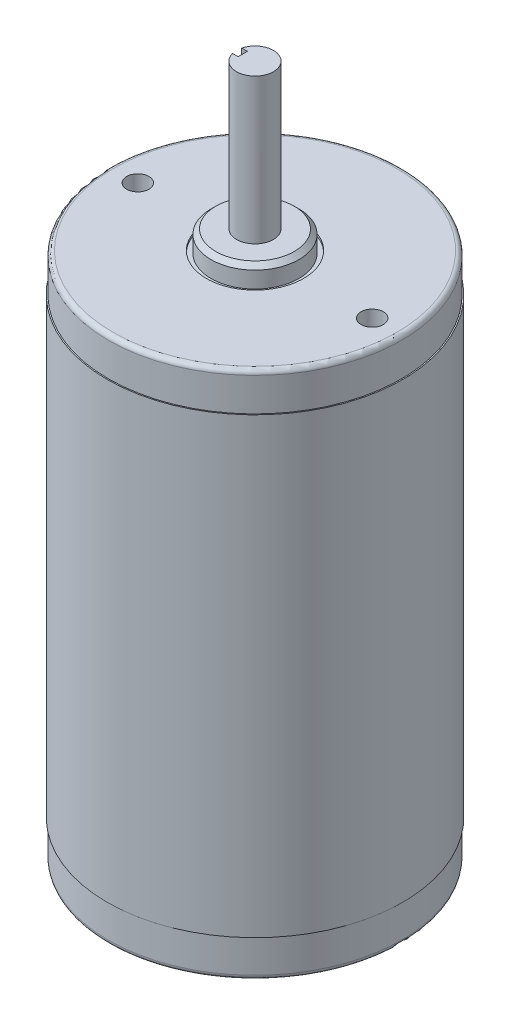
ISO-10303-21;
HEADER;
FILE_DESCRIPTION(('STEP AP214'),'2;1');
FILE_NAME('part.step','',(''),(''),'','','');
FILE_SCHEMA(('AUTOMOTIVE_DESIGN { 1 0 10303 214 1 1 1 1 }'));
ENDSEC;
DATA;
#1=APPLICATION_CONTEXT('core data for automotive mechanical design processes');
#2=APPLICATION_PROTOCOL_DEFINITION('international standard','automotive_design',2000,#1);
#3=PRODUCT_CONTEXT('',#1,'mechanical');
#4=PRODUCT('Part','Part','',(#3));
#5=PRODUCT_RELATED_PRODUCT_CATEGORY('part','',(#4));
#6=PRODUCT_DEFINITION_FORMATION('','',#4);
#7=PRODUCT_DEFINITION_CONTEXT('part definition',#1,'design');
#8=PRODUCT_DEFINITION('design','',#6,#7);
#9=PRODUCT_DEFINITION_SHAPE('','',#8);
#10=(LENGTH_UNIT() NAMED_UNIT(*) SI_UNIT(.MILLI.,.METRE.));
#11=(NAMED_UNIT(*) PLANE_ANGLE_UNIT() SI_UNIT($,.RADIAN.));
#12=(NAMED_UNIT(*) SI_UNIT($,.STERADIAN.) SOLID_ANGLE_UNIT());
#13=UNCERTAINTY_MEASURE_WITH_UNIT(LENGTH_MEASURE(1.E-05),#10,'distance_accuracy_value','');
#14=(GEOMETRIC_REPRESENTATION_CONTEXT(3) GLOBAL_UNCERTAINTY_ASSIGNED_CONTEXT((#13)) GLOBAL_UNIT_ASSIGNED_CONTEXT((#10,
#11,#12)) REPRESENTATION_CONTEXT('',''));
#15=CARTESIAN_POINT('',(0.,0.,0.));
#16=DIRECTION('',(0.,0.,1.));
#17=DIRECTION('',(1.,0.,0.));
#18=AXIS2_PLACEMENT_3D('',#15,#16,#17);
#19=CARTESIAN_POINT('',(15.0368,4.76250000000002,0.));
#20=DIRECTION('',(0.,-1.,0.));
#21=DIRECTION('',(0.,0.,-1.));
#22=AXIS2_PLACEMENT_3D('',#19,#20,#21);
#23=PLANE('',#22);
#24=CARTESIAN_POINT('',(18.6071001970192,4.76250000000002,-11.2073689985821));
#25=DIRECTION('',(0.,-1.,0.));
#26=DIRECTION('',(0.,0.,-1.));
#27=AXIS2_PLACEMENT_3D('',#24,#25,#26);
#28=CIRCLE('',#27,4.317848745);
#29=CARTESIAN_POINT('',(18.6071001970192,4.76250000000002,-15.5252177435821));
#30=VERTEX_POINT('',#29);
#31=EDGE_CURVE('E112',#30,#30,#28,.T.);
#32=ORIENTED_EDGE('',*,*,#31,.F.);
#33=EDGE_LOOP('',(#32));
#34=FACE_BOUND('',#33,.T.);
#35=CARTESIAN_POINT('',(0.,4.76250000000002,0.));
#36=DIRECTION('',(0.,-1.,0.));
#37=DIRECTION('',(0.,0.,-1.));
#38=AXIS2_PLACEMENT_3D('',#35,#36,#37);
#39=CIRCLE('',#38,30.7499999999996);
#40=CARTESIAN_POINT('',(0.,4.76250000000002,-30.7499999999996));
#41=VERTEX_POINT('',#40);
#42=EDGE_CURVE('E173',#41,#41,#39,.T.);
#43=ORIENTED_EDGE('',*,*,#42,.T.);
#44=EDGE_LOOP('',(#43));
#45=FACE_BOUND('',#44,.T.);
#46=CARTESIAN_POINT('',(0.,4.76250000000005,0.));
#47=DIRECTION('',(0.,-1.,0.));
#48=DIRECTION('',(0.,0.,-1.));
#49=AXIS2_PLACEMENT_3D('',#46,#47,#48);
#50=CIRCLE('',#49,15.0368);
#51=CARTESIAN_POINT('',(0.,4.76250000000005,-15.0368));
#52=VERTEX_POINT('',#51);
#53=EDGE_CURVE('E158',#52,#52,#50,.T.);
#54=ORIENTED_EDGE('',*,*,#53,.F.);
#55=EDGE_LOOP('',(#54));
#56=FACE_BOUND('',#55,.T.);
#57=CARTESIAN_POINT('',(11.2073689985823,4.76250000000002,-18.607100197019));
#58=DIRECTION('',(0.,-1.,0.));
#59=DIRECTION('',(-0.467582362918068,0.,-0.883949508675668));
#60=AXIS2_PLACEMENT_3D('',#57,#58,#59);
#61=CIRCLE('',#60,4.317848745);
#62=CARTESIAN_POINT('',(9.18841907967238,4.76250000000002,-22.4238604736976));
#63=VERTEX_POINT('',#62);
#64=EDGE_CURVE('E314',#63,#63,#61,.T.);
#65=ORIENTED_EDGE('',*,*,#64,.F.);
#66=EDGE_LOOP('',(#65));
#67=FACE_BOUND('',#66,.T.);
#68=ADVANCED_FACE('F36',(#34,#45,#56,#67),#23,.T.);
#69=CARTESIAN_POINT('',(0.,0.,0.));
#70=DIRECTION('',(0.,-1.,0.));
#71=DIRECTION('',(0.,0.,-1.));
#72=AXIS2_PLACEMENT_3D('',#69,#70,#71);
#73=PLANE('',#72);
#74=CARTESIAN_POINT('',(0.,0.,0.));
#75=DIRECTION('',(0.,-1.,0.));
#76=DIRECTION('',(0.,0.,-1.));
#77=AXIS2_PLACEMENT_3D('',#74,#75,#76);
#78=CIRCLE('',#77,14.0368);
#79=CARTESIAN_POINT('',(0.,0.,-14.0368));
#80=VERTEX_POINT('',#79);
#81=EDGE_CURVE('E179',#80,#80,#78,.T.);
#82=ORIENTED_EDGE('',*,*,#81,.T.);
#83=EDGE_LOOP('',(#82));
#84=FACE_BOUND('',#83,.T.);
#85=ADVANCED_FACE('F275',(#84),#73,.T.);
#86=CARTESIAN_POINT('',(0.,0.,0.));
#87=DIRECTION('',(0.,-1.,0.));
#88=DIRECTION('',(0.,0.,-1.));
#89=AXIS2_PLACEMENT_3D('',#86,#87,#88);
#90=CYLINDRICAL_SURFACE('',#89,15.0368);
#91=CARTESIAN_POINT('',(0.,1.,0.));
#92=DIRECTION('',(0.,-1.,0.));
#93=DIRECTION('',(0.,0.,-1.));
#94=AXIS2_PLACEMENT_3D('',#91,#92,#93);
#95=CIRCLE('',#94,15.0368);
#96=CARTESIAN_POINT('',(0.,1.,-15.0368));
#97=VERTEX_POINT('',#96);
#98=EDGE_CURVE('E105',#97,#97,#95,.F.);
#99=ORIENTED_EDGE('',*,*,#98,.T.);
#100=EDGE_LOOP('',(#99));
#101=FACE_BOUND('',#100,.T.);
#102=ORIENTED_EDGE('',*,*,#53,.T.);
#103=EDGE_LOOP('',(#102));
#104=FACE_BOUND('',#103,.T.);
#105=ADVANCED_FACE('F271',(#101,#104),#90,.T.);
#106=CARTESIAN_POINT('',(0.,0.,0.));
#107=DIRECTION('',(0.,-1.,0.));
#108=DIRECTION('',(0.,0.,-1.));
#109=AXIS2_PLACEMENT_3D('',#106,#107,#108);
#110=CYLINDRICAL_SURFACE('',#109,31.7499999999996);
#111=CARTESIAN_POINT('',(0.,5.76250000000002,0.));
#112=DIRECTION('',(0.,-1.,0.));
#113=DIRECTION('',(0.,0.,-1.));
#114=AXIS2_PLACEMENT_3D('',#111,#112,#113);
#115=CIRCLE('',#114,31.7499999999996);
#116=CARTESIAN_POINT('',(0.,5.76250000000002,-31.7499999999996));
#117=VERTEX_POINT('',#116);
#118=EDGE_CURVE('E176',#117,#117,#115,.F.);
#119=ORIENTED_EDGE('',*,*,#118,.T.);
#120=EDGE_LOOP('',(#119));
#121=FACE_BOUND('',#120,.T.);
#122=CARTESIAN_POINT('',(0.,12.9921000000001,0.));
#123=DIRECTION('',(0.,-1.,0.));
#124=DIRECTION('',(0.,0.,-1.));
#125=AXIS2_PLACEMENT_3D('',#122,#123,#124);
#126=CIRCLE('',#125,31.7499999999996);
#127=CARTESIAN_POINT('',(0.,12.9921000000001,-31.7499999999996));
#128=VERTEX_POINT('',#127);
#129=EDGE_CURVE('E155',#128,#128,#126,.T.);
#130=ORIENTED_EDGE('',*,*,#129,.T.);
#131=EDGE_LOOP('',(#130));
#132=FACE_BOUND('',#131,.T.);
#133=ADVANCED_FACE('F267',(#121,#132),#110,.T.);
#134=CARTESIAN_POINT('',(31.7499999999996,12.9921000000001,0.));
#135=DIRECTION('',(0.,-1.,0.));
#136=DIRECTION('',(0.,0.,-1.));
#137=AXIS2_PLACEMENT_3D('',#134,#135,#136);
#138=PLANE('',#137);
#139=CARTESIAN_POINT('',(0.,12.9921000000001,0.));
#140=DIRECTION('',(0.,-1.,0.));
#141=DIRECTION('',(0.,0.,-1.));
#142=AXIS2_PLACEMENT_3D('',#139,#140,#141);
#143=CIRCLE('',#142,32.004);
#144=CARTESIAN_POINT('',(0.,12.9921000000001,-32.004));
#145=VERTEX_POINT('',#144);
#146=EDGE_CURVE('E152',#145,#145,#143,.T.);
#147=ORIENTED_EDGE('',*,*,#146,.T.);
#148=EDGE_LOOP('',(#147));
#149=FACE_BOUND('',#148,.T.);
#150=ORIENTED_EDGE('',*,*,#129,.F.);
#151=EDGE_LOOP('',(#150));
#152=FACE_BOUND('',#151,.T.);
#153=ADVANCED_FACE('F263',(#149,#152),#138,.T.);
#154=CARTESIAN_POINT('',(0.,0.,0.));
#155=DIRECTION('',(0.,-1.,0.));
#156=DIRECTION('',(0.,0.,-1.));
#157=AXIS2_PLACEMENT_3D('',#154,#155,#156);
#158=CYLINDRICAL_SURFACE('',#157,32.0039999999998);
#159=CARTESIAN_POINT('',(0.,111.1377,0.));
#160=DIRECTION('',(0.,-1.,0.));
#161=DIRECTION('',(0.,0.,-1.));
#162=AXIS2_PLACEMENT_3D('',#159,#160,#161);
#163=CIRCLE('',#162,32.0039999999996);
#164=CARTESIAN_POINT('',(0.,111.1377,-32.0039999999996));
#165=VERTEX_POINT('',#164);
#166=EDGE_CURVE('E149',#165,#165,#163,.T.);
#167=ORIENTED_EDGE('',*,*,#166,.T.);
#168=EDGE_LOOP('',(#167));
#169=FACE_BOUND('',#168,.T.);
#170=ORIENTED_EDGE('',*,*,#146,.F.);
#171=EDGE_LOOP('',(#170));
#172=FACE_BOUND('',#171,.T.);
#173=ADVANCED_FACE('F259',(#169,#172),#158,.T.);
#174=CARTESIAN_POINT('',(32.0039999999996,111.1377,0.));
#175=DIRECTION('',(0.,1.,0.));
#176=DIRECTION('',(0.,0.,1.));
#177=AXIS2_PLACEMENT_3D('',#174,#175,#176);
#178=PLANE('',#177);
#179=CARTESIAN_POINT('',(0.,111.1377,0.));
#180=DIRECTION('',(0.,-1.,0.));
#181=DIRECTION('',(0.,0.,-1.));
#182=AXIS2_PLACEMENT_3D('',#179,#180,#181);
#183=CIRCLE('',#182,31.7499999999996);
#184=CARTESIAN_POINT('',(0.,111.1377,-31.7499999999996));
#185=VERTEX_POINT('',#184);
#186=EDGE_CURVE('E146',#185,#185,#183,.T.);
#187=ORIENTED_EDGE('',*,*,#186,.T.);
#188=EDGE_LOOP('',(#187));
#189=FACE_BOUND('',#188,.T.);
#190=ORIENTED_EDGE('',*,*,#166,.F.);
#191=EDGE_LOOP('',(#190));
#192=FACE_BOUND('',#191,.T.);
#193=ADVANCED_FACE('F255',(#189,#192),#178,.T.);
#194=CARTESIAN_POINT('',(0.,0.,0.));
#195=DIRECTION('',(0.,-1.,0.));
#196=DIRECTION('',(0.,0.,-1.));
#197=AXIS2_PLACEMENT_3D('',#194,#195,#196);
#198=CYLINDRICAL_SURFACE('',#197,31.7499999999996);
#199=CARTESIAN_POINT('',(0.,118.3673,0.));
#200=DIRECTION('',(0.,1.,0.));
#201=DIRECTION('',(0.,0.,1.));
#202=AXIS2_PLACEMENT_3D('',#199,#200,#201);
#203=CIRCLE('',#202,31.7499999999996);
#204=CARTESIAN_POINT('',(0.,118.3673,31.7499999999996));
#205=VERTEX_POINT('',#204);
#206=EDGE_CURVE('E167',#205,#205,#203,.F.);
#207=ORIENTED_EDGE('',*,*,#206,.T.);
#208=EDGE_LOOP('',(#207));
#209=FACE_BOUND('',#208,.T.);
#210=ORIENTED_EDGE('',*,*,#186,.F.);
#211=EDGE_LOOP('',(#210));
#212=FACE_BOUND('',#211,.T.);
#213=ADVANCED_FACE('F251',(#209,#212),#198,.T.);
#214=CARTESIAN_POINT('',(31.7499999999996,119.3673,0.));
#215=DIRECTION('',(0.,1.,0.));
#216=DIRECTION('',(0.,0.,1.));
#217=AXIS2_PLACEMENT_3D('',#214,#215,#216);
#218=PLANE('',#217);
#219=CARTESIAN_POINT('',(-25.4,119.3673,0.));
#220=DIRECTION('',(0.,1.,0.));
#221=DIRECTION('',(0.,0.,1.));
#222=AXIS2_PLACEMENT_3D('',#219,#220,#221);
#223=CIRCLE('',#222,2.413);
#224=CARTESIAN_POINT('',(-25.4,119.3673,2.413));
#225=VERTEX_POINT('',#224);
#226=EDGE_CURVE('E120',#225,#225,#223,.T.);
#227=ORIENTED_EDGE('',*,*,#226,.F.);
#228=EDGE_LOOP('',(#227));
#229=FACE_BOUND('',#228,.T.);
#230=CARTESIAN_POINT('',(25.4,119.3673,0.));
#231=DIRECTION('',(0.,1.,0.));
#232=DIRECTION('',(0.,0.,1.));
#233=AXIS2_PLACEMENT_3D('',#230,#231,#232);
#234=CIRCLE('',#233,2.413);
#235=CARTESIAN_POINT('',(25.4,119.3673,2.41299999999999));
#236=VERTEX_POINT('',#235);
#237=EDGE_CURVE('E126',#236,#236,#234,.T.);
#238=ORIENTED_EDGE('',*,*,#237,.F.);
#239=EDGE_LOOP('',(#238));
#240=FACE_BOUND('',#239,.T.);
#241=CARTESIAN_POINT('',(0.,119.3673,0.));
#242=DIRECTION('',(0.,1.,0.));
#243=DIRECTION('',(0.,0.,1.));
#244=AXIS2_PLACEMENT_3D('',#241,#242,#243);
#245=CIRCLE('',#244,30.7499999999996);
#246=CARTESIAN_POINT('',(0.,119.3673,30.7499999999996));
#247=VERTEX_POINT('',#246);
#248=EDGE_CURVE('E170',#247,#247,#245,.T.);
#249=ORIENTED_EDGE('',*,*,#248,.T.);
#250=EDGE_LOOP('',(#249));
#251=FACE_BOUND('',#250,.T.);
#252=CARTESIAN_POINT('',(0.,119.3673,0.));
#253=DIRECTION('',(0.,-1.,0.));
#254=DIRECTION('',(0.,0.,-1.));
#255=AXIS2_PLACEMENT_3D('',#252,#253,#254);
#256=CIRCLE('',#255,10.5282999999996);
#257=CARTESIAN_POINT('',(0.,119.3673,-10.5282999999996));
#258=VERTEX_POINT('',#257);
#259=EDGE_CURVE('E143',#258,#258,#256,.T.);
#260=ORIENTED_EDGE('',*,*,#259,.T.);
#261=EDGE_LOOP('',(#260));
#262=FACE_BOUND('',#261,.T.);
#263=ADVANCED_FACE('F247',(#229,#240,#251,#262),#218,.T.);
#264=CARTESIAN_POINT('',(0.,0.,0.));
#265=DIRECTION('',(0.,-1.,0.));
#266=DIRECTION('',(0.,0.,-1.));
#267=AXIS2_PLACEMENT_3D('',#264,#265,#266);
#268=CYLINDRICAL_SURFACE('',#267,10.5282999999996);
#269=CARTESIAN_POINT('',(0.,118.8593,0.));
#270=DIRECTION('',(0.,-1.,0.));
#271=DIRECTION('',(0.,0.,-1.));
#272=AXIS2_PLACEMENT_3D('',#269,#270,#271);
#273=CIRCLE('',#272,10.5282999999996);
#274=CARTESIAN_POINT('',(0.,118.8593,-10.5282999999996));
#275=VERTEX_POINT('',#274);
#276=EDGE_CURVE('E140',#275,#275,#273,.T.);
#277=ORIENTED_EDGE('',*,*,#276,.T.);
#278=EDGE_LOOP('',(#277));
#279=FACE_BOUND('',#278,.T.);
#280=ORIENTED_EDGE('',*,*,#259,.F.);
#281=EDGE_LOOP('',(#280));
#282=FACE_BOUND('',#281,.T.);
#283=ADVANCED_FACE('F243',(#279,#282),#268,.F.);
#284=CARTESIAN_POINT('',(10.5282999999996,118.8593,0.));
#285=DIRECTION('',(0.,1.,0.));
#286=DIRECTION('',(0.,0.,1.));
#287=AXIS2_PLACEMENT_3D('',#284,#285,#286);
#288=PLANE('',#287);
#289=CARTESIAN_POINT('',(0.,118.8593,0.));
#290=DIRECTION('',(0.,-1.,0.));
#291=DIRECTION('',(0.,0.,-1.));
#292=AXIS2_PLACEMENT_3D('',#289,#290,#291);
#293=CIRCLE('',#292,9.52499999999959);
#294=CARTESIAN_POINT('',(0.,118.8593,-9.52499999999959));
#295=VERTEX_POINT('',#294);
#296=EDGE_CURVE('E137',#295,#295,#293,.T.);
#297=ORIENTED_EDGE('',*,*,#296,.T.);
#298=EDGE_LOOP('',(#297));
#299=FACE_BOUND('',#298,.T.);
#300=ORIENTED_EDGE('',*,*,#276,.F.);
#301=EDGE_LOOP('',(#300));
#302=FACE_BOUND('',#301,.T.);
#303=ADVANCED_FACE('F239',(#299,#302),#288,.T.);
#304=CARTESIAN_POINT('',(0.,0.,0.));
#305=DIRECTION('',(0.,-1.,0.));
#306=DIRECTION('',(0.,0.,-1.));
#307=AXIS2_PLACEMENT_3D('',#304,#305,#306);
#308=CYLINDRICAL_SURFACE('',#307,9.52499999999959);
#309=CARTESIAN_POINT('',(0.,122.41508364,0.));
#310=DIRECTION('',(0.,1.,0.));
#311=DIRECTION('',(0.,0.,1.));
#312=AXIS2_PLACEMENT_3D('',#309,#310,#311);
#313=CIRCLE('',#312,9.52499999999959);
#314=CARTESIAN_POINT('',(0.,122.41508364,9.52499999999959));
#315=VERTEX_POINT('',#314);
#316=EDGE_CURVE('E161',#315,#315,#313,.F.);
#317=ORIENTED_EDGE('',*,*,#316,.T.);
#318=EDGE_LOOP('',(#317));
#319=FACE_BOUND('',#318,.T.);
#320=ORIENTED_EDGE('',*,*,#296,.F.);
#321=EDGE_LOOP('',(#320));
#322=FACE_BOUND('',#321,.T.);
#323=ADVANCED_FACE('F235',(#319,#322),#308,.T.);
#324=CARTESIAN_POINT('',(9.52499999999959,123.4313,0.));
#325=DIRECTION('',(0.,1.,0.));
#326=DIRECTION('',(0.,0.,1.));
#327=AXIS2_PLACEMENT_3D('',#324,#325,#326);
#328=PLANE('',#327);
#329=CARTESIAN_POINT('',(0.,123.4313,0.));
#330=DIRECTION('',(0.,1.,0.));
#331=DIRECTION('',(0.,0.,1.));
#332=AXIS2_PLACEMENT_3D('',#329,#330,#331);
#333=CIRCLE('',#332,8.50878363999956);
#334=CARTESIAN_POINT('',(0.,123.4313,8.50878363999956));
#335=VERTEX_POINT('',#334);
#336=EDGE_CURVE('E164',#335,#335,#333,.T.);
#337=ORIENTED_EDGE('',*,*,#336,.T.);
#338=EDGE_LOOP('',(#337));
#339=FACE_BOUND('',#338,.T.);
#340=CARTESIAN_POINT('',(0.,123.4313,0.));
#341=DIRECTION('',(0.,-1.,0.));
#342=DIRECTION('',(0.,0.,-1.));
#343=AXIS2_PLACEMENT_3D('',#340,#341,#342);
#344=CIRCLE('',#343,4.00000469999957);
#345=CARTESIAN_POINT('',(0.,123.4313,-4.00000469999957));
#346=VERTEX_POINT('',#345);
#347=EDGE_CURVE('E134',#346,#346,#344,.T.);
#348=ORIENTED_EDGE('',*,*,#347,.T.);
#349=EDGE_LOOP('',(#348));
#350=FACE_BOUND('',#349,.T.);
#351=ADVANCED_FACE('F230',(#339,#350),#328,.T.);
#352=CARTESIAN_POINT('',(0.,0.,0.));
#353=DIRECTION('',(0.,-1.,0.));
#354=DIRECTION('',(0.,0.,-1.));
#355=AXIS2_PLACEMENT_3D('',#352,#353,#354);
#356=CYLINDRICAL_SURFACE('',#355,4.00000469999952);
#357=DIRECTION('',(0.,-1.,0.));
#358=VECTOR('',#357,1.);
#359=CARTESIAN_POINT('',(-3.87298871674244,0.,-0.999998));
#360=LINE('',#359,#358);
#361=CARTESIAN_POINT('',(-3.87298871674238,154.931364,-0.999998));
#362=VERTEX_POINT('',#361);
#363=CARTESIAN_POINT('',(-3.87298871674244,125.131364,-0.999997999999999));
#364=VERTEX_POINT('',#363);
#365=EDGE_CURVE('E118',#362,#364,#360,.T.);
#366=ORIENTED_EDGE('',*,*,#365,.F.);
#367=CARTESIAN_POINT('',(0.,154.931364,0.));
#368=DIRECTION('',(0.,-1.,0.));
#369=DIRECTION('',(0.,0.,-1.));
#370=AXIS2_PLACEMENT_3D('',#367,#368,#369);
#371=CIRCLE('',#370,4.00000469999946);
#372=CARTESIAN_POINT('',(-3.87298871674238,154.931364,0.999998));
#373=VERTEX_POINT('',#372);
#374=EDGE_CURVE('E132',#362,#373,#371,.T.);
#375=ORIENTED_EDGE('',*,*,#374,.T.);
#376=DIRECTION('',(0.,-1.,0.));
#377=VECTOR('',#376,1.);
#378=CARTESIAN_POINT('',(-3.87298871674244,0.,0.999998));
#379=LINE('',#378,#377);
#380=CARTESIAN_POINT('',(-3.87298871674244,125.131364,0.999998));
#381=VERTEX_POINT('',#380);
#382=EDGE_CURVE('E100',#381,#373,#379,.F.);
#383=ORIENTED_EDGE('',*,*,#382,.F.);
#384=CARTESIAN_POINT('',(0.,125.131364,0.));
#385=DIRECTION('',(0.,-1.,0.));
#386=DIRECTION('',(0.,0.,-1.));
#387=AXIS2_PLACEMENT_3D('',#384,#385,#386);
#388=CIRCLE('',#387,4.00000469999952);
#389=EDGE_CURVE('E104',#364,#381,#388,.F.);
#390=ORIENTED_EDGE('',*,*,#389,.F.);
#391=EDGE_LOOP('',(#366,#375,#383,#390));
#392=FACE_BOUND('',#391,.T.);
#393=ORIENTED_EDGE('',*,*,#347,.F.);
#394=EDGE_LOOP('',(#393));
#395=FACE_BOUND('',#394,.T.);
#396=ADVANCED_FACE('F225',(#392,#395),#356,.T.);
#397=CARTESIAN_POINT('',(4.00000469999946,154.931364,0.));
#398=DIRECTION('',(0.,1.,0.));
#399=DIRECTION('',(0.,0.,1.));
#400=AXIS2_PLACEMENT_3D('',#397,#398,#399);
#401=PLANE('',#400);
#402=DIRECTION('',(-1.,0.,0.));
#403=VECTOR('',#402,1.);
#404=CARTESIAN_POINT('',(-4.00000469999946,154.931364,-0.999998));
#405=LINE('',#404,#403);
#406=CARTESIAN_POINT('',(-2.65000469999946,154.931364,-0.999998));
#407=VERTEX_POINT('',#406);
#408=EDGE_CURVE('E94',#407,#362,#405,.T.);
#409=ORIENTED_EDGE('',*,*,#408,.F.);
#410=DIRECTION('',(0.,0.,-1.));
#411=VECTOR('',#410,1.);
#412=CARTESIAN_POINT('',(-2.65000469999946,154.931364,0.999998));
#413=LINE('',#412,#411);
#414=CARTESIAN_POINT('',(-2.65000469999946,154.931364,0.999998));
#415=VERTEX_POINT('',#414);
#416=EDGE_CURVE('E89',#415,#407,#413,.T.);
#417=ORIENTED_EDGE('',*,*,#416,.F.);
#418=DIRECTION('',(1.,0.,0.));
#419=VECTOR('',#418,1.);
#420=CARTESIAN_POINT('',(4.00000469999946,154.931364,0.999997999999999));
#421=LINE('',#420,#419);
#422=EDGE_CURVE('E97',#373,#415,#421,.T.);
#423=ORIENTED_EDGE('',*,*,#422,.F.);
#424=ORIENTED_EDGE('',*,*,#374,.F.);
#425=EDGE_LOOP('',(#409,#417,#423,#424));
#426=FACE_BOUND('',#425,.T.);
#427=ADVANCED_FACE('F107',(#426),#401,.T.);
#428=CARTESIAN_POINT('',(0.,122.41508364,0.));
#429=DIRECTION('',(0.,-1.,0.));
#430=DIRECTION('',(0.,0.,-1.));
#431=AXIS2_PLACEMENT_3D('',#428,#429,#430);
#432=CONICAL_SURFACE('',#431,9.52499999999959,0.785398163397455);
#433=ORIENTED_EDGE('',*,*,#336,.F.);
#434=EDGE_LOOP('',(#433));
#435=FACE_BOUND('',#434,.T.);
#436=ORIENTED_EDGE('',*,*,#316,.F.);
#437=EDGE_LOOP('',(#436));
#438=FACE_BOUND('',#437,.T.);
#439=ADVANCED_FACE('F283',(#435,#438),#432,.T.);
#440=CARTESIAN_POINT('',(0.,118.3673,0.));
#441=DIRECTION('',(0.,1.,0.));
#442=DIRECTION('',(0.,0.,1.));
#443=AXIS2_PLACEMENT_3D('',#440,#441,#442);
#444=TOROIDAL_SURFACE('',#443,30.7499999999996,1.);
#445=ORIENTED_EDGE('',*,*,#248,.F.);
#446=EDGE_LOOP('',(#445));
#447=FACE_BOUND('',#446,.T.);
#448=ORIENTED_EDGE('',*,*,#206,.F.);
#449=EDGE_LOOP('',(#448));
#450=FACE_BOUND('',#449,.T.);
#451=ADVANCED_FACE('F286',(#447,#450),#444,.T.);
#452=CARTESIAN_POINT('',(0.,5.76250000000002,0.));
#453=DIRECTION('',(0.,-1.,0.));
#454=DIRECTION('',(0.,0.,-1.));
#455=AXIS2_PLACEMENT_3D('',#452,#453,#454);
#456=TOROIDAL_SURFACE('',#455,30.7499999999996,1.);
#457=ORIENTED_EDGE('',*,*,#118,.F.);
#458=EDGE_LOOP('',(#457));
#459=FACE_BOUND('',#458,.T.);
#460=ORIENTED_EDGE('',*,*,#42,.F.);
#461=EDGE_LOOP('',(#460));
#462=FACE_BOUND('',#461,.T.);
#463=ADVANCED_FACE('F290',(#459,#462),#456,.T.);
#464=CARTESIAN_POINT('',(0.,1.,0.));
#465=DIRECTION('',(0.,-1.,0.));
#466=DIRECTION('',(0.,0.,-1.));
#467=AXIS2_PLACEMENT_3D('',#464,#465,#466);
#468=TOROIDAL_SURFACE('',#467,14.0368,1.);
#469=ORIENTED_EDGE('',*,*,#98,.F.);
#470=EDGE_LOOP('',(#469));
#471=FACE_BOUND('',#470,.T.);
#472=ORIENTED_EDGE('',*,*,#81,.F.);
#473=EDGE_LOOP('',(#472));
#474=FACE_BOUND('',#473,.T.);
#475=ADVANCED_FACE('F294',(#471,#474),#468,.T.);
#476=CARTESIAN_POINT('',(25.4,105.9053,0.));
#477=DIRECTION('',(0.,1.,0.));
#478=DIRECTION('',(0.,0.,1.));
#479=AXIS2_PLACEMENT_3D('',#476,#477,#478);
#480=CONICAL_SURFACE('',#479,2.413,1.02974425867665);
#481=CARTESIAN_POINT('',(25.4,104.455423326286,0.));
#482=VERTEX_POINT('',#481);
#483=VERTEX_LOOP('',#482);
#484=FACE_BOUND('',#483,.T.);
#485=CARTESIAN_POINT('',(25.4,105.9053,0.));
#486=DIRECTION('',(0.,1.,0.));
#487=DIRECTION('',(0.,0.,1.));
#488=AXIS2_PLACEMENT_3D('',#485,#486,#487);
#489=CIRCLE('',#488,2.413);
#490=CARTESIAN_POINT('',(25.4,105.9053,2.41299999999999));
#491=VERTEX_POINT('',#490);
#492=EDGE_CURVE('E129',#491,#491,#489,.T.);
#493=ORIENTED_EDGE('',*,*,#492,.T.);
#494=EDGE_LOOP('',(#493));
#495=FACE_BOUND('',#494,.T.);
#496=ADVANCED_FACE('F297',(#484,#495),#480,.F.);
#497=CARTESIAN_POINT('',(25.4,119.3673,0.));
#498=DIRECTION('',(0.,1.,0.));
#499=DIRECTION('',(0.,0.,1.));
#500=AXIS2_PLACEMENT_3D('',#497,#498,#499);
#501=CYLINDRICAL_SURFACE('',#500,2.413);
#502=ORIENTED_EDGE('',*,*,#492,.F.);
#503=EDGE_LOOP('',(#502));
#504=FACE_BOUND('',#503,.T.);
#505=ORIENTED_EDGE('',*,*,#237,.T.);
#506=EDGE_LOOP('',(#505));
#507=FACE_BOUND('',#506,.T.);
#508=ADVANCED_FACE('F303',(#504,#507),#501,.F.);
#509=CARTESIAN_POINT('',(-25.4,105.9053,0.));
#510=DIRECTION('',(0.,1.,0.));
#511=DIRECTION('',(0.,0.,1.));
#512=AXIS2_PLACEMENT_3D('',#509,#510,#511);
#513=CONICAL_SURFACE('',#512,2.413,1.02974425867665);
#514=CARTESIAN_POINT('',(-25.4,104.455423326286,0.));
#515=VERTEX_POINT('',#514);
#516=VERTEX_LOOP('',#515);
#517=FACE_BOUND('',#516,.T.);
#518=CARTESIAN_POINT('',(-25.4,105.9053,0.));
#519=DIRECTION('',(0.,1.,0.));
#520=DIRECTION('',(0.,0.,1.));
#521=AXIS2_PLACEMENT_3D('',#518,#519,#520);
#522=CIRCLE('',#521,2.413);
#523=CARTESIAN_POINT('',(-25.4,105.9053,2.413));
#524=VERTEX_POINT('',#523);
#525=EDGE_CURVE('E123',#524,#524,#522,.T.);
#526=ORIENTED_EDGE('',*,*,#525,.T.);
#527=EDGE_LOOP('',(#526));
#528=FACE_BOUND('',#527,.T.);
#529=ADVANCED_FACE('F460',(#517,#528),#513,.F.);
#530=CARTESIAN_POINT('',(-25.4,119.3673,0.));
#531=DIRECTION('',(0.,1.,0.));
#532=DIRECTION('',(0.,0.,1.));
#533=AXIS2_PLACEMENT_3D('',#530,#531,#532);
#534=CYLINDRICAL_SURFACE('',#533,2.413);
#535=ORIENTED_EDGE('',*,*,#525,.F.);
#536=EDGE_LOOP('',(#535));
#537=FACE_BOUND('',#536,.T.);
#538=ORIENTED_EDGE('',*,*,#226,.T.);
#539=EDGE_LOOP('',(#538));
#540=FACE_BOUND('',#539,.T.);
#541=ADVANCED_FACE('F206',(#537,#540),#534,.F.);
#542=CARTESIAN_POINT('',(-4.00000469999946,125.131364,-0.999998));
#543=DIRECTION('',(0.,0.,-1.));
#544=DIRECTION('',(-1.,0.,0.));
#545=AXIS2_PLACEMENT_3D('',#542,#543,#544);
#546=PLANE('',#545);
#547=ORIENTED_EDGE('',*,*,#365,.T.);
#548=CARTESIAN_POINT('',(-3.77205253622548,125.131364,1.33103616178266));
#549=CARTESIAN_POINT('',(-2.65000469999946,126.680330899222,3.27937094164799));
#550=CARTESIAN_POINT('',(-2.65000469999946,128.37941199248,5.41652363966225));
#551=CARTESIAN_POINT('',(-3.77934787986316,125.131364,1.31035958572997));
#552=CARTESIAN_POINT('',(-2.65000469999946,126.736592172214,3.22277790993573));
#553=CARTESIAN_POINT('',(-2.65000469999946,128.498437077224,5.32189946343232));
#554=CARTESIAN_POINT('',(-3.78688178049076,125.131364,1.28846924327357));
#555=CARTESIAN_POINT('',(-2.65000469999946,126.790932891802,3.16332209979151));
#556=CARTESIAN_POINT('',(-2.65000469999946,128.613612219918,5.22255753361907));
#557=CARTESIAN_POINT('',(-3.80225745528384,125.131364,1.24236383263502));
#558=CARTESIAN_POINT('',(-2.65000469999946,126.895620301709,3.0391686595416));
#559=CARTESIAN_POINT('',(-2.65000469999946,128.835860953167,5.01530960797677));
#560=CARTESIAN_POINT('',(-3.81009904623772,125.131364,1.21815013582223));
#561=CARTESIAN_POINT('',(-2.65000469999946,126.945968752504,2.97447163392969));
#562=CARTESIAN_POINT('',(-2.65000469999946,128.94293925698,4.90740867057663));
#563=CARTESIAN_POINT('',(-3.83378193698883,125.131364,1.14234192680871));
#564=CARTESIAN_POINT('',(-2.65000469999946,127.09050081922,2.77366678992861));
#565=CARTESIAN_POINT('',(-2.65000469999946,129.250807759058,4.57289094233682));
#566=CARTESIAN_POINT('',(-3.84984225206587,125.131364,1.08741366041103));
#567=CARTESIAN_POINT('',(-2.65000469999946,127.178569465784,2.63043893051047));
#568=CARTESIAN_POINT('',(-2.65000469999946,129.439187176058,4.33469031762252));
#569=CARTESIAN_POINT('',(-3.88302233649366,125.131364,0.962709831179737));
#570=CARTESIAN_POINT('',(-2.65000469999946,127.347178074563,2.31093774653683));
#571=CARTESIAN_POINT('',(-2.65000469999946,129.801028270285,3.80443552071563));
#572=CARTESIAN_POINT('',(-3.90003904062567,125.131364,0.891944205785426));
#573=CARTESIAN_POINT('',(-2.65000469999946,127.425531935166,2.13276852234205));
#574=CARTESIAN_POINT('',(-2.65000469999946,129.970010171236,3.50934777651805));
#575=CARTESIAN_POINT('',(-3.93126187345239,125.131364,0.742337411267302));
#576=CARTESIAN_POINT('',(-2.65000469999946,127.560953675501,1.762445483181));
#577=CARTESIAN_POINT('',(-2.65000469999946,130.263003863669,2.89730949533643));
#578=CARTESIAN_POINT('',(-3.94546394534409,125.131364,0.663484830887021));
#579=CARTESIAN_POINT('',(-2.65000469999946,127.61796906099,1.57028497776356));
#580=CARTESIAN_POINT('',(-2.65000469999946,130.386950956518,2.58032827679295));
#581=CARTESIAN_POINT('',(-3.97112281685507,125.131364,0.488870041226458));
#582=CARTESIAN_POINT('',(-2.65000469999946,127.717242591739,1.15010635097395));
#583=CARTESIAN_POINT('',(-2.65000469999946,130.603240218673,1.88842040406917));
#584=CARTESIAN_POINT('',(-3.98194969041176,125.131364,0.392262441285944));
#585=CARTESIAN_POINT('',(-2.65000469999946,127.756437557749,0.92080954076528));
#586=CARTESIAN_POINT('',(-2.65000469999946,130.68905202542,1.51145012296254));
#587=CARTESIAN_POINT('',(-3.99646656407829,125.131364,0.195125406346462));
#588=CARTESIAN_POINT('',(-2.65000469999946,127.808309773464,0.456360437959449));
#589=CARTESIAN_POINT('',(-2.65000469999946,130.802696708509,0.748749368977164));
#590=CARTESIAN_POINT('',(-4.00015147923807,125.131364,0.0945932290297761));
#591=CARTESIAN_POINT('',(-2.65000469999946,127.820952399051,0.221271444556343));
#592=CARTESIAN_POINT('',(-2.65000469999946,130.830488276536,0.363012852235534));
#593=CARTESIAN_POINT('',(-3.99983371054113,125.131364,-0.116705397597714));
#594=CARTESIAN_POINT('',(-2.65000469999946,127.819870878714,-0.272993315742964));
#595=CARTESIAN_POINT('',(-2.65000469999946,130.828109032822,-0.447869470357286));
#596=CARTESIAN_POINT('',(-3.9950052273867,125.131364,-0.227465741372834));
#597=CARTESIAN_POINT('',(-2.65000469999946,127.803315074345,-0.532074987479384));
#598=CARTESIAN_POINT('',(-2.65000469999946,130.791711834506,-0.873006281229567));
#599=CARTESIAN_POINT('',(-3.97681477133616,125.131364,-0.443530778428705));
#600=CARTESIAN_POINT('',(-2.65000469999946,127.737773492575,-1.04225183731076));
#601=CARTESIAN_POINT('',(-2.65000469999946,130.648208348373,-1.71104594040608));
#602=CARTESIAN_POINT('',(-3.96346282209161,125.131364,-0.548841723181977));
#603=CARTESIAN_POINT('',(-2.65000469999946,127.688849650875,-1.29326854627852));
#604=CARTESIAN_POINT('',(-2.65000469999946,130.541185112252,-2.12396256369033));
#605=CARTESIAN_POINT('',(-3.9387869847967,125.131364,-0.698999124297957));
#606=CARTESIAN_POINT('',(-2.65000469999946,127.590693170281,-1.6571734238877));
#607=CARTESIAN_POINT('',(-2.65000469999946,130.327740570596,-2.72366730880767));
#608=CARTESIAN_POINT('',(-3.92979321487852,125.131364,-0.747725671848739));
#609=CARTESIAN_POINT('',(-2.65000469999946,127.553888217001,-1.77626954979812));
#610=CARTESIAN_POINT('',(-2.65000469999946,130.247832008025,-2.92018883566378));
#611=CARTESIAN_POINT('',(-3.91064378821933,125.131364,-0.842147909858951));
#612=CARTESIAN_POINT('',(-2.65000469999946,127.471931752588,-2.00926820211678));
#613=CARTESIAN_POINT('',(-2.65000469999946,130.070377041231,-3.30511899831169));
#614=CARTESIAN_POINT('',(-3.90048844169229,125.131364,-0.887844404406935));
#615=CARTESIAN_POINT('',(-2.65000469999946,127.42678775126,-2.12316854918685));
#616=CARTESIAN_POINT('',(-2.65000469999946,129.972835342143,-3.49352978176734));
#617=CARTESIAN_POINT('',(-3.87938460630094,125.131364,-0.975948991809566));
#618=CARTESIAN_POINT('',(-2.65000469999946,127.327869660197,-2.34511920104226));
#619=CARTESIAN_POINT('',(-2.65000469999946,129.759714065886,-3.86114998176289));
#620=CARTESIAN_POINT('',(-3.86843240652575,125.131364,-1.0183395052101));
#621=CARTESIAN_POINT('',(-2.65000469999946,127.274058664089,-2.4531370823433));
#622=CARTESIAN_POINT('',(-2.65000469999946,129.644046760497,-4.04030869589892));
#623=CARTESIAN_POINT('',(-3.8462353088222,125.131364,-1.09921863204885));
#624=CARTESIAN_POINT('',(-2.65000469999946,127.158007374947,-2.66150775317925));
#625=CARTESIAN_POINT('',(-2.65000469999946,129.395298977938,-4.38637369391589));
#626=CARTESIAN_POINT('',(-3.83499010711835,125.131364,-1.13770297551681));
#627=CARTESIAN_POINT('',(-2.65000469999946,127.095762499888,-2.76185457308737));
#628=CARTESIAN_POINT('',(-2.65000469999946,129.262199801634,-4.55326651571092));
#629=CARTESIAN_POINT('',(-3.82383863535526,125.131364,-1.17400838616367));
#630=CARTESIAN_POINT('',(-2.65000469999946,127.029357829332,-2.857677314813));
#631=CARTESIAN_POINT('',(-2.65000469999946,129.120644862447,-4.7128124285987));
#632=(BOUNDED_SURFACE() B_SPLINE_SURFACE(3,2,((#548,#549,#550),(#551,#552,#553),(#554,#555,
#556),(#557,#558,#559),(#560,#561,#562),(#563,#564,#565),(#566,#567,#568),(#569,#570,#571),
(#572,#573,#574),(#575,#576,#577),(#578,#579,#580),(#581,#582,#583),(#584,#585,#586),(#587,#588,
#589),(#590,#591,#592),(#593,#594,#595),(#596,#597,#598),(#599,#600,#601),(#602,#603,#604),
(#605,#606,#607),(#608,#609,#610),(#611,#612,#613),(#614,#615,#616),(#617,#618,#619),(#620,#621,
#622),(#623,#624,#625),(#626,#627,#628),(#629,#630,#631)),.UNSPECIFIED.,.F.,.F.,
.F.) B_SPLINE_SURFACE_WITH_KNOTS((4,2,2,2,2,2,2,2,2,2,2,2,2,4),(3,3),(0.,0.455905189904546,
0.911542916189987,1.81917739841483,2.83538017654398,3.85303714917104,5.00815227866146,
6.16408952834018,7.43838790931215,8.71119046089198,9.34689963835991,9.98243943618415,
10.6211560901975,11.2605635936343),(0.,1.),
.UNSPECIFIED.) GEOMETRIC_REPRESENTATION_ITEM() RATIONAL_B_SPLINE_SURFACE(((1.,0.977662972776179,
1.),(1.,0.977516083340094,1.),(1.,0.977364355873015,1.),(1.,0.977054625877471,1.),(1.,
0.976896627082586,1.),(1.,0.976419324192914,1.),(1.,0.976095487546466,1.),(1.,0.975426124108651,
1.),(1.,0.975082636321973,1.),(1.,0.974452104791631,1.),(1.,0.974165142523245,1.),(1.,
0.973646523924508,1.),(1.,0.973427573501074,1.),(1.,0.973133964674581,1.),(1.,0.973059409078155,
1.),(1.,0.973065839051414,1.),(1.,0.973163532797418,1.),(1.,0.973531413169791,1.),(1.,
0.97380139718156,1.),(1.,0.974300039735976,1.),(1.,0.974481740595187,1.),(1.,0.974868492291817,
1.),(1.,0.975073536894922,1.),(1.,0.975499493074106,1.),(1.,0.975720478840614,1.),(1.,
0.976168202404627,1.),(1.,0.976394946165118,1.),(1.,0.976619713879038,1.))) REPRESENTATION_ITEM('') SURFACE());
#633=CARTESIAN_POINT('',(-3.87298871674244,125.131364,-0.999997999999999));
#634=CARTESIAN_POINT('',(-3.85054700170579,125.187728511665,-0.999997999999999));
#635=CARTESIAN_POINT('',(-3.82797844935532,125.24404242056,-0.999998));
#636=CARTESIAN_POINT('',(-3.78285809352954,125.356679075071,-0.999998));
#637=CARTESIAN_POINT('',(-3.76030629062787,125.413001820916,-0.999998));
#638=CARTESIAN_POINT('',(-3.715486841355,125.525773890297,-0.999998));
#639=CARTESIAN_POINT('',(-3.69321925326862,125.582223237091,-0.999998));
#640=CARTESIAN_POINT('',(-3.64909227062288,125.695280364111,-0.999998));
#641=CARTESIAN_POINT('',(-3.62723287077345,125.751888142273,-0.999998));
#642=CARTESIAN_POINT('',(-3.56237816496446,125.922081392563,-0.999998));
#643=CARTESIAN_POINT('',(-3.52013842032934,126.035956918671,-0.999998));
#644=CARTESIAN_POINT('',(-3.43811915852559,126.264582298502,-0.999998));
#645=CARTESIAN_POINT('',(-3.39833944884768,126.379332083018,-0.999998));
#646=CARTESIAN_POINT('',(-3.32189474752071,126.608533120746,-0.999998));
#647=CARTESIAN_POINT('',(-3.28520151331679,126.722974927848,-0.999998));
#648=CARTESIAN_POINT('',(-3.21463891581548,126.952727843899,-0.999998));
#649=CARTESIAN_POINT('',(-3.18076965132182,127.068038983109,-0.999998));
#650=CARTESIAN_POINT('',(-3.08360752385952,127.415144992566,-0.999998));
#651=CARTESIAN_POINT('',(-3.0247319940689,127.648196849075,-0.999998));
#652=CARTESIAN_POINT('',(-2.91932096307216,128.117617035348,-0.999998));
#653=CARTESIAN_POINT('',(-2.87281329626265,128.353991606124,-0.999998));
#654=CARTESIAN_POINT('',(-2.79270914690942,128.828960884448,-0.999998));
#655=CARTESIAN_POINT('',(-2.75911457853876,129.067555915783,-0.999998));
#656=CARTESIAN_POINT('',(-2.70484357337893,129.548757240489,-0.999998));
#657=CARTESIAN_POINT('',(-2.68430680286163,129.791379323254,-0.999998));
#658=CARTESIAN_POINT('',(-2.65688106408567,130.277368262929,-0.999998));
#659=CARTESIAN_POINT('',(-2.64999073791957,130.520735043322,-0.999998));
#660=CARTESIAN_POINT('',(-2.65000469999946,130.764108766406,-0.999998));
#661=B_SPLINE_CURVE_WITH_KNOTS('',3,(#633,#634,#635,#636,#637,#638,#639,#640,#641,#642,#643,
#644,#645,#646,#647,#648,#649,#650,#651,#652,#653,#654,#655,#656,#657,#658,#659,#660),
.UNSPECIFIED.,.F.,.F.,(4,2,2,2,2,2,2,2,2,2,2,2,2,4),(0.,0.182003581479297,0.364013132805826,
0.546059428348195,0.728103362955059,1.09244937922111,1.45676684752771,1.81727116610192,
2.17778809254488,2.8985551785558,3.6209309106289,4.34341368280602,5.07349960400813,
5.80351287339585),.UNSPECIFIED.);
#662=CARTESIAN_POINT('',(-2.65000469999946,130.764108766406,-0.999998));
#663=VERTEX_POINT('',#662);
#664=EDGE_CURVE('E64',#364,#663,#661,.T.);
#665=ORIENTED_EDGE('',*,*,#664,.T.);
#666=DIRECTION('',(0.,1.,0.));
#667=VECTOR('',#666,1.);
#668=CARTESIAN_POINT('',(-2.65000469999946,125.131364,-0.999998));
#669=LINE('',#668,#667);
#670=EDGE_CURVE('E93',#663,#407,#669,.T.);
#671=ORIENTED_EDGE('',*,*,#670,.T.);
#672=ORIENTED_EDGE('',*,*,#408,.T.);
#673=EDGE_LOOP('',(#547,#665,#671,#672));
#674=FACE_BOUND('',#673,.T.);
#675=ADVANCED_FACE('F202',(#674),#546,.F.);
#676=CARTESIAN_POINT('',(-2.65000469999946,125.131364,0.999998));
#677=DIRECTION('',(1.,0.,0.));
#678=DIRECTION('',(0.,0.,-1.));
#679=AXIS2_PLACEMENT_3D('',#676,#677,#678);
#680=PLANE('',#679);
#681=ORIENTED_EDGE('',*,*,#670,.F.);
#682=CARTESIAN_POINT('',(-2.65000469999946,129.120644862447,-4.7128124285987));
#683=CARTESIAN_POINT('',(-2.65000469999946,129.262199801634,-4.55326651571092));
#684=CARTESIAN_POINT('',(-2.65000469999946,129.395298977938,-4.38637369391589));
#685=CARTESIAN_POINT('',(-2.65000469999946,129.644046760497,-4.04030869589892));
#686=CARTESIAN_POINT('',(-2.65000469999946,129.759714065886,-3.86114998176289));
#687=CARTESIAN_POINT('',(-2.65000469999946,129.972835342143,-3.49352978176734));
#688=CARTESIAN_POINT('',(-2.65000469999946,130.070377041231,-3.3051189983117));
#689=CARTESIAN_POINT('',(-2.65000469999946,130.247832008025,-2.92018883566378));
#690=CARTESIAN_POINT('',(-2.65000469999946,130.327740570596,-2.72366730880767));
#691=CARTESIAN_POINT('',(-2.65000469999946,130.541185112252,-2.12396256369033));
#692=CARTESIAN_POINT('',(-2.65000469999946,130.648208348373,-1.71104594040608));
#693=CARTESIAN_POINT('',(-2.65000469999946,130.791711834506,-0.873006281229567));
#694=CARTESIAN_POINT('',(-2.65000469999946,130.828109032822,-0.447869470357287));
#695=CARTESIAN_POINT('',(-2.65000469999946,130.830488276536,0.363012852235535));
#696=CARTESIAN_POINT('',(-2.65000469999946,130.802696708509,0.748749368977164));
#697=CARTESIAN_POINT('',(-2.65000469999946,130.68905202542,1.51145012296254));
#698=CARTESIAN_POINT('',(-2.65000469999946,130.603240218673,1.88842040406917));
#699=CARTESIAN_POINT('',(-2.65000469999946,130.386950956518,2.58032827679295));
#700=CARTESIAN_POINT('',(-2.65000469999946,130.263003863669,2.89730949533643));
#701=CARTESIAN_POINT('',(-2.65000469999946,129.970010171236,3.50934777651805));
#702=CARTESIAN_POINT('',(-2.65000469999946,129.801028270285,3.80443552071563));
#703=CARTESIAN_POINT('',(-2.65000469999946,129.439187176058,4.33469031762252));
#704=CARTESIAN_POINT('',(-2.65000469999946,129.250807759058,4.57289094233682));
#705=CARTESIAN_POINT('',(-2.65000469999946,128.94293925698,4.90740867057663));
#706=CARTESIAN_POINT('',(-2.65000469999946,128.835860953168,5.01530960797677));
#707=CARTESIAN_POINT('',(-2.65000469999946,128.613612219918,5.22255753361907));
#708=CARTESIAN_POINT('',(-2.65000469999946,128.498437077224,5.32189946343232));
#709=CARTESIAN_POINT('',(-2.65000469999946,128.37941199248,5.41652363966225));
#710=B_SPLINE_CURVE_WITH_KNOTS('',3,(#682,#683,#684,#685,#686,#687,#688,#689,#690,#691,#692,
#693,#694,#695,#696,#697,#698,#699,#700,#701,#702,#703,#704,#705,#706,#707,#708,#709),
.UNSPECIFIED.,.F.,.F.,(4,2,2,2,2,2,2,2,2,2,2,2,2,4),(0.,0.639407503436849,1.27812415745018,
1.91366395527443,2.54937313274236,3.82217568432219,5.09647406529416,6.25241131497288,
7.4075264444633,8.42518341709036,9.4413861952195,10.3490206774444,10.8046584037298,
11.2605635936343),.UNSPECIFIED.);
#711=CARTESIAN_POINT('',(-2.65000469999946,130.764108766406,0.999998));
#712=VERTEX_POINT('',#711);
#713=EDGE_CURVE('E49',#663,#712,#710,.T.);
#714=ORIENTED_EDGE('',*,*,#713,.T.);
#715=DIRECTION('',(0.,1.,0.));
#716=VECTOR('',#715,1.);
#717=CARTESIAN_POINT('',(-2.65000469999946,125.131364,0.999998));
#718=LINE('',#717,#716);
#719=EDGE_CURVE('E85',#712,#415,#718,.T.);
#720=ORIENTED_EDGE('',*,*,#719,.T.);
#721=ORIENTED_EDGE('',*,*,#416,.T.);
#722=EDGE_LOOP('',(#681,#714,#720,#721));
#723=FACE_BOUND('',#722,.T.);
#724=ADVANCED_FACE('F87',(#723),#680,.F.);
#725=CARTESIAN_POINT('',(-4.00000469999946,125.131364,0.999998));
#726=DIRECTION('',(0.,0.,1.));
#727=DIRECTION('',(1.,0.,0.));
#728=AXIS2_PLACEMENT_3D('',#725,#726,#727);
#729=PLANE('',#728);
#730=ORIENTED_EDGE('',*,*,#719,.F.);
#731=CARTESIAN_POINT('',(-2.65000469999946,130.764108766406,0.999998));
#732=CARTESIAN_POINT('',(-2.65000308563662,130.578509608384,0.999998));
#733=CARTESIAN_POINT('',(-2.65400483980996,130.392933319313,0.999998));
#734=CARTESIAN_POINT('',(-2.66996181748567,130.022129075017,0.999998));
#735=CARTESIAN_POINT('',(-2.68191676882339,129.836901108089,0.999998));
#736=CARTESIAN_POINT('',(-2.72960952427225,129.282435041534,0.999998));
#737=CARTESIAN_POINT('',(-2.77717538510697,128.914152424807,0.999998));
#738=CARTESIAN_POINT('',(-2.90210237319604,128.188000602212,0.999998));
#739=CARTESIAN_POINT('',(-2.97903877651901,127.830057798776,0.999998));
#740=CARTESIAN_POINT('',(-3.11548084775778,127.298698145918,0.999998));
#741=CARTESIAN_POINT('',(-3.16446556207259,127.122510491642,0.999998));
#742=CARTESIAN_POINT('',(-3.26908248553144,126.772124728988,0.999998));
#743=CARTESIAN_POINT('',(-3.32471421635219,126.597926478439,0.999998));
#744=CARTESIAN_POINT('',(-3.42027342363595,126.315831408012,0.999998));
#745=CARTESIAN_POINT('',(-3.45837214873378,126.207308219356,0.999998));
#746=CARTESIAN_POINT('',(-3.5367215255426,125.991056477737,0.999998));
#747=CARTESIAN_POINT('',(-3.57697190890758,125.883327827582,0.999998));
#748=CARTESIAN_POINT('',(-3.63875760681404,125.721995657578,0.999998));
#749=CARTESIAN_POINT('',(-3.65963717535378,125.668139024046,0.999998));
#750=CARTESIAN_POINT('',(-3.70175120279675,125.560564127634,0.999998));
#751=CARTESIAN_POINT('',(-3.72298566454655,125.506845865869,0.999998));
#752=CARTESIAN_POINT('',(-3.76569981773005,125.39950685602,0.999998));
#753=CARTESIAN_POINT('',(-3.78717951093154,125.345886108643,0.999998));
#754=CARTESIAN_POINT('',(-3.83014200459574,125.238647404739,0.999998));
#755=CARTESIAN_POINT('',(-3.85162480496779,125.185029448176,0.999998));
#756=CARTESIAN_POINT('',(-3.87298871674426,125.131364000001,0.999998));
#757=B_SPLINE_CURVE_WITH_KNOTS('',3,(#731,#732,#733,#734,#735,#736,#737,#738,#739,#740,#741,
#742,#743,#744,#745,#746,#747,#748,#749,#750,#751,#752,#753,#754,#755,#756),.UNSPECIFIED.,.F.,
.F.,(4,2,2,2,2,2,2,2,2,2,2,2,4),(0.,0.556709630374192,1.11340021068736,2.2259969436086,
3.32307926082934,3.87157948342234,4.42004025935537,4.76506879025839,5.11005439055486,
5.28334061119011,5.45662822239957,5.62991708356442,5.80320163054687),.UNSPECIFIED.);
#758=EDGE_CURVE('E11',#712,#381,#757,.T.);
#759=ORIENTED_EDGE('',*,*,#758,.T.);
#760=ORIENTED_EDGE('',*,*,#382,.T.);
#761=ORIENTED_EDGE('',*,*,#422,.T.);
#762=EDGE_LOOP('',(#730,#759,#760,#761));
#763=FACE_BOUND('',#762,.T.);
#764=ADVANCED_FACE('F98',(#763),#729,.F.);
#765=ORIENTED_EDGE('',*,*,#758,.F.);
#766=ORIENTED_EDGE('',*,*,#713,.F.);
#767=ORIENTED_EDGE('',*,*,#664,.F.);
#768=ORIENTED_EDGE('',*,*,#389,.T.);
#769=EDGE_LOOP('',(#765,#766,#767,#768));
#770=FACE_BOUND('',#769,.T.);
#771=ADVANCED_FACE('F199',(#770),#632,.F.);
#772=CARTESIAN_POINT('',(18.6071001970192,4.76250000000002,-11.2073689985821));
#773=DIRECTION('',(0.,1.,0.));
#774=DIRECTION('',(0.,0.,-1.));
#775=AXIS2_PLACEMENT_3D('',#772,#773,#774);
#776=CONICAL_SURFACE('',#775,4.317848745,0.78539816339745);
#777=CARTESIAN_POINT('',(18.6071001970192,2.51250000000002,-11.2073689985821));
#778=DIRECTION('',(0.,-1.,0.));
#779=DIRECTION('',(0.,0.,-1.));
#780=AXIS2_PLACEMENT_3D('',#777,#778,#779);
#781=CIRCLE('',#780,2.06784874499999);
#782=CARTESIAN_POINT('',(18.6071001970192,2.51250000000002,-13.2752177435821));
#783=VERTEX_POINT('',#782);
#784=EDGE_CURVE('E108',#783,#783,#781,.T.);
#785=ORIENTED_EDGE('',*,*,#784,.F.);
#786=EDGE_LOOP('',(#785));
#787=FACE_BOUND('',#786,.T.);
#788=ORIENTED_EDGE('',*,*,#31,.T.);
#789=EDGE_LOOP('',(#788));
#790=FACE_BOUND('',#789,.T.);
#791=ADVANCED_FACE('F323',(#787,#790),#776,.T.);
#792=CARTESIAN_POINT('',(18.6071001970192,2.51250000000002,-11.2073689985821));
#793=DIRECTION('',(0.,-1.,0.));
#794=DIRECTION('',(0.,0.,-1.));
#795=AXIS2_PLACEMENT_3D('',#792,#793,#794);
#796=PLANE('',#795);
#797=ORIENTED_EDGE('',*,*,#784,.T.);
#798=EDGE_LOOP('',(#797));
#799=FACE_BOUND('',#798,.T.);
#800=ADVANCED_FACE('F328',(#799),#796,.T.);
#801=CARTESIAN_POINT('',(11.2073689985823,4.76250000000002,-18.607100197019));
#802=DIRECTION('',(0.,1.,0.));
#803=DIRECTION('',(-0.467582362918068,0.,-0.883949508675668));
#804=AXIS2_PLACEMENT_3D('',#801,#802,#803);
#805=CONICAL_SURFACE('',#804,4.317848745,0.78539816339745);
#806=CARTESIAN_POINT('',(11.2073689985823,2.51250000000002,-18.607100197019));
#807=DIRECTION('',(0.,-1.,0.));
#808=DIRECTION('',(0.,0.,-1.));
#809=AXIS2_PLACEMENT_3D('',#806,#807,#808);
#810=CIRCLE('',#809,2.06784874499999);
#811=CARTESIAN_POINT('',(11.2073689985823,2.51250000000002,-20.674948942019));
#812=VERTEX_POINT('',#811);
#813=EDGE_CURVE('E316',#812,#812,#810,.T.);
#814=ORIENTED_EDGE('',*,*,#813,.F.);
#815=EDGE_LOOP('',(#814));
#816=FACE_BOUND('',#815,.T.);
#817=ORIENTED_EDGE('',*,*,#64,.T.);
#818=EDGE_LOOP('',(#817));
#819=FACE_BOUND('',#818,.T.);
#820=ADVANCED_FACE('F334',(#816,#819),#805,.T.);
#821=CARTESIAN_POINT('',(11.2073689985823,2.51250000000002,-18.607100197019));
#822=DIRECTION('',(0.,-1.,0.));
#823=DIRECTION('',(-0.467582362918068,0.,-0.883949508675668));
#824=AXIS2_PLACEMENT_3D('',#821,#822,#823);
#825=PLANE('',#824);
#826=ORIENTED_EDGE('',*,*,#813,.T.);
#827=EDGE_LOOP('',(#826));
#828=FACE_BOUND('',#827,.T.);
#829=ADVANCED_FACE('F342',(#828),#825,.T.);
#830=CLOSED_SHELL('',(#68,#85,#105,#133,#153,#173,#193,#213,#263,#283,#303,#323,#351,#396,#427,
#439,#451,#463,#475,#496,#508,#529,#541,#675,#724,#764,#771,#791,#800,#820,#829));
#831=MANIFOLD_SOLID_BREP('B2',#830);
#832=ADVANCED_BREP_SHAPE_REPRESENTATION('',(#18,#831),#14);
#833=SHAPE_DEFINITION_REPRESENTATION(#9,#832);
ENDSEC;
END-ISO-10303-21;
